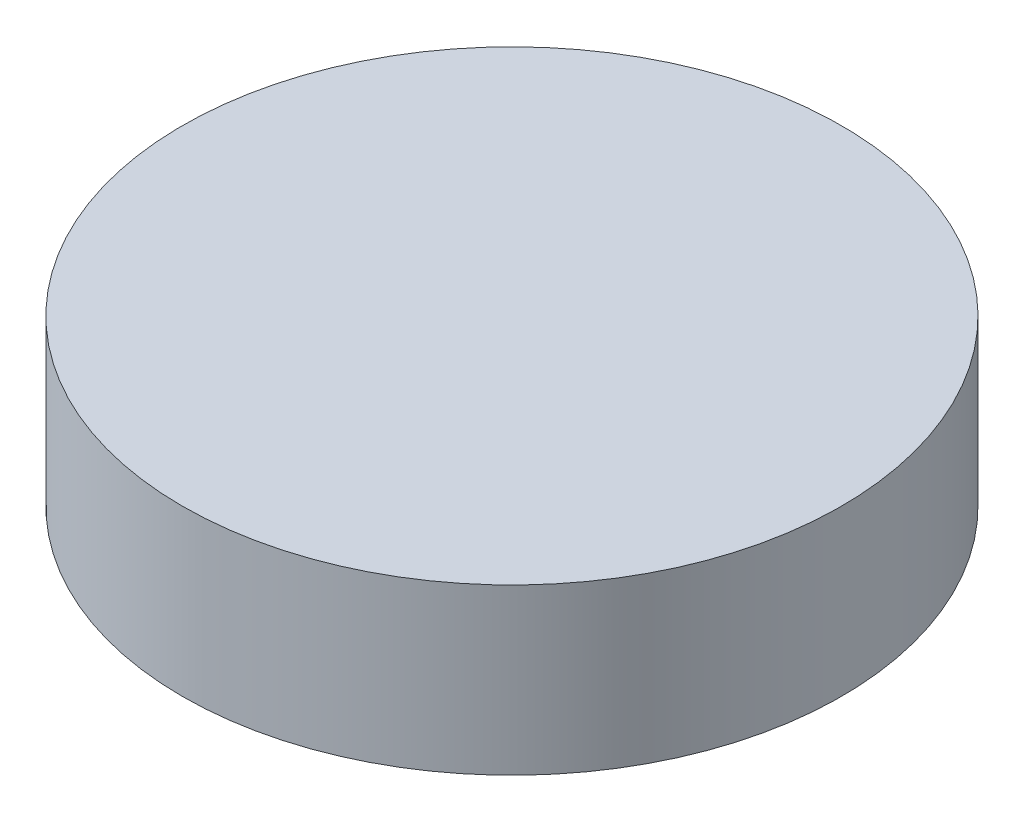
ISO-10303-21;
HEADER;
FILE_DESCRIPTION(('STEP AP214'),'2;1');
FILE_NAME('part.step','',(''),(''),'','','');
FILE_SCHEMA(('AUTOMOTIVE_DESIGN { 1 0 10303 214 1 1 1 1 }'));
ENDSEC;
DATA;
#1=APPLICATION_CONTEXT('core data for automotive mechanical design processes');
#2=APPLICATION_PROTOCOL_DEFINITION('international standard','automotive_design',2000,#1);
#3=PRODUCT_CONTEXT('',#1,'mechanical');
#4=PRODUCT('Part','Part','',(#3));
#5=PRODUCT_RELATED_PRODUCT_CATEGORY('part','',(#4));
#6=PRODUCT_DEFINITION_FORMATION('','',#4);
#7=PRODUCT_DEFINITION_CONTEXT('part definition',#1,'design');
#8=PRODUCT_DEFINITION('design','',#6,#7);
#9=PRODUCT_DEFINITION_SHAPE('','',#8);
#10=(LENGTH_UNIT() NAMED_UNIT(*) SI_UNIT(.MILLI.,.METRE.));
#11=(NAMED_UNIT(*) PLANE_ANGLE_UNIT() SI_UNIT($,.RADIAN.));
#12=(NAMED_UNIT(*) SI_UNIT($,.STERADIAN.) SOLID_ANGLE_UNIT());
#13=UNCERTAINTY_MEASURE_WITH_UNIT(LENGTH_MEASURE(1.E-05),#10,'distance_accuracy_value','');
#14=(GEOMETRIC_REPRESENTATION_CONTEXT(3) GLOBAL_UNCERTAINTY_ASSIGNED_CONTEXT((#13)) GLOBAL_UNIT_ASSIGNED_CONTEXT((#10,
#11,#12)) REPRESENTATION_CONTEXT('',''));
#15=CARTESIAN_POINT('',(0.,0.,0.));
#16=DIRECTION('',(0.,0.,1.));
#17=DIRECTION('',(1.,0.,0.));
#18=AXIS2_PLACEMENT_3D('',#15,#16,#17);
#19=CARTESIAN_POINT('',(0.,5.,0.));
#20=DIRECTION('',(0.,-1.,0.));
#21=DIRECTION('',(0.,0.,-1.));
#22=AXIS2_PLACEMENT_3D('',#19,#20,#21);
#23=CYLINDRICAL_SURFACE('',#22,10.);
#24=CARTESIAN_POINT('',(0.,5.,0.));
#25=DIRECTION('',(0.,1.,0.));
#26=DIRECTION('',(0.,0.,1.));
#27=AXIS2_PLACEMENT_3D('',#24,#25,#26);
#28=CIRCLE('',#27,10.);
#29=CARTESIAN_POINT('',(0.,5.,10.));
#30=VERTEX_POINT('',#29);
#31=EDGE_CURVE('E10',#30,#30,#28,.T.);
#32=ORIENTED_EDGE('',*,*,#31,.F.);
#33=EDGE_LOOP('',(#32));
#34=FACE_BOUND('',#33,.T.);
#35=CARTESIAN_POINT('',(0.,0.,0.));
#36=DIRECTION('',(0.,1.,0.));
#37=DIRECTION('',(0.,0.,1.));
#38=AXIS2_PLACEMENT_3D('',#35,#36,#37);
#39=CIRCLE('',#38,10.);
#40=CARTESIAN_POINT('',(0.,0.,10.));
#41=VERTEX_POINT('',#40);
#42=EDGE_CURVE('E39',#41,#41,#39,.T.);
#43=ORIENTED_EDGE('',*,*,#42,.T.);
#44=EDGE_LOOP('',(#43));
#45=FACE_BOUND('',#44,.T.);
#46=ADVANCED_FACE('F36',(#34,#45),#23,.T.);
#47=CARTESIAN_POINT('',(0.,5.,0.));
#48=DIRECTION('',(0.,1.,0.));
#49=DIRECTION('',(0.,0.,1.));
#50=AXIS2_PLACEMENT_3D('',#47,#48,#49);
#51=PLANE('',#50);
#52=ORIENTED_EDGE('',*,*,#31,.T.);
#53=EDGE_LOOP('',(#52));
#54=FACE_BOUND('',#53,.T.);
#55=ADVANCED_FACE('F65',(#54),#51,.T.);
#56=CARTESIAN_POINT('',(0.,0.,0.));
#57=DIRECTION('',(0.,1.,0.));
#58=DIRECTION('',(0.,0.,1.));
#59=AXIS2_PLACEMENT_3D('',#56,#57,#58);
#60=PLANE('',#59);
#61=CARTESIAN_POINT('',(0.,0.,0.));
#62=DIRECTION('',(0.,-1.,0.));
#63=DIRECTION('',(0.,0.,-1.));
#64=AXIS2_PLACEMENT_3D('',#61,#62,#63);
#65=CIRCLE('',#64,7.65);
#66=CARTESIAN_POINT('',(0.,0.,-7.65));
#67=VERTEX_POINT('',#66);
#68=EDGE_CURVE('E48',#67,#67,#65,.T.);
#69=ORIENTED_EDGE('',*,*,#68,.F.);
#70=EDGE_LOOP('',(#69));
#71=FACE_BOUND('',#70,.T.);
#72=ORIENTED_EDGE('',*,*,#42,.F.);
#73=EDGE_LOOP('',(#72));
#74=FACE_BOUND('',#73,.T.);
#75=ADVANCED_FACE('F59',(#71,#74),#60,.F.);
#76=CARTESIAN_POINT('',(0.,3.,0.));
#77=DIRECTION('',(0.,-1.,0.));
#78=DIRECTION('',(0.,0.,-1.));
#79=AXIS2_PLACEMENT_3D('',#76,#77,#78);
#80=CYLINDRICAL_SURFACE('',#79,7.65);
#81=CARTESIAN_POINT('',(0.,3.,0.));
#82=DIRECTION('',(0.,-1.,0.));
#83=DIRECTION('',(0.,0.,-1.));
#84=AXIS2_PLACEMENT_3D('',#81,#82,#83);
#85=CIRCLE('',#84,7.65);
#86=CARTESIAN_POINT('',(0.,3.,-7.65));
#87=VERTEX_POINT('',#86);
#88=EDGE_CURVE('E46',#87,#87,#85,.T.);
#89=ORIENTED_EDGE('',*,*,#88,.F.);
#90=EDGE_LOOP('',(#89));
#91=FACE_BOUND('',#90,.T.);
#92=ORIENTED_EDGE('',*,*,#68,.T.);
#93=EDGE_LOOP('',(#92));
#94=FACE_BOUND('',#93,.T.);
#95=ADVANCED_FACE('F56',(#91,#94),#80,.F.);
#96=CARTESIAN_POINT('',(0.,3.,0.));
#97=DIRECTION('',(0.,-1.,0.));
#98=DIRECTION('',(0.,0.,-1.));
#99=AXIS2_PLACEMENT_3D('',#96,#97,#98);
#100=PLANE('',#99);
#101=ORIENTED_EDGE('',*,*,#88,.T.);
#102=EDGE_LOOP('',(#101));
#103=FACE_BOUND('',#102,.T.);
#104=ADVANCED_FACE('F54',(#103),#100,.T.);
#105=CLOSED_SHELL('',(#46,#55,#75,#95,#104));
#106=MANIFOLD_SOLID_BREP('B2',#105);
#107=ADVANCED_BREP_SHAPE_REPRESENTATION('',(#18,#106),#14);
#108=SHAPE_DEFINITION_REPRESENTATION(#9,#107);
ENDSEC;
END-ISO-10303-21;
